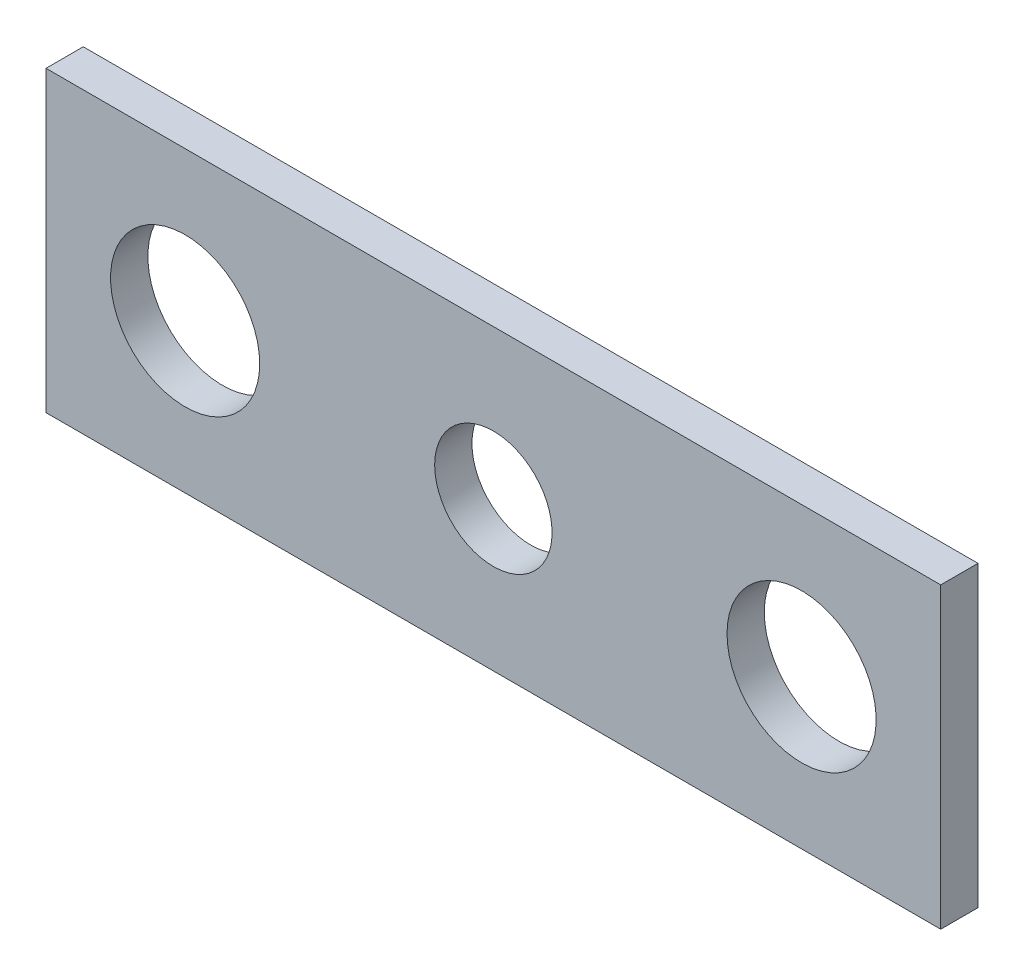
ISO-10303-21;
HEADER;
FILE_DESCRIPTION(('STEP AP214'),'2;1');
FILE_NAME('part.step','',(''),(''),'','','');
FILE_SCHEMA(('AUTOMOTIVE_DESIGN { 1 0 10303 214 1 1 1 1 }'));
ENDSEC;
DATA;
#1=APPLICATION_CONTEXT('core data for automotive mechanical design processes');
#2=APPLICATION_PROTOCOL_DEFINITION('international standard','automotive_design',2000,#1);
#3=PRODUCT_CONTEXT('',#1,'mechanical');
#4=PRODUCT('Part','Part','',(#3));
#5=PRODUCT_RELATED_PRODUCT_CATEGORY('part','',(#4));
#6=PRODUCT_DEFINITION_FORMATION('','',#4);
#7=PRODUCT_DEFINITION_CONTEXT('part definition',#1,'design');
#8=PRODUCT_DEFINITION('design','',#6,#7);
#9=PRODUCT_DEFINITION_SHAPE('','',#8);
#10=(LENGTH_UNIT() NAMED_UNIT(*) SI_UNIT(.MILLI.,.METRE.));
#11=(NAMED_UNIT(*) PLANE_ANGLE_UNIT() SI_UNIT($,.RADIAN.));
#12=(NAMED_UNIT(*) SI_UNIT($,.STERADIAN.) SOLID_ANGLE_UNIT());
#13=UNCERTAINTY_MEASURE_WITH_UNIT(LENGTH_MEASURE(1.E-05),#10,'distance_accuracy_value','');
#14=(GEOMETRIC_REPRESENTATION_CONTEXT(3) GLOBAL_UNCERTAINTY_ASSIGNED_CONTEXT((#13)) GLOBAL_UNIT_ASSIGNED_CONTEXT((#10,
#11,#12)) REPRESENTATION_CONTEXT('',''));
#15=CARTESIAN_POINT('',(0.,0.,0.));
#16=DIRECTION('',(0.,0.,1.));
#17=DIRECTION('',(1.,0.,0.));
#18=AXIS2_PLACEMENT_3D('',#15,#16,#17);
#19=CARTESIAN_POINT('',(0.,0.,6.35));
#20=DIRECTION('',(0.,0.,1.));
#21=DIRECTION('',(1.,0.,0.));
#22=AXIS2_PLACEMENT_3D('',#19,#20,#21);
#23=PLANE('',#22);
#24=CARTESIAN_POINT('',(-128.7,25.4,6.35));
#25=DIRECTION('',(0.,0.,1.));
#26=DIRECTION('',(1.,0.,0.));
#27=AXIS2_PLACEMENT_3D('',#24,#25,#26);
#28=CIRCLE('',#27,12.7);
#29=CARTESIAN_POINT('',(-116.,25.4,6.35));
#30=VERTEX_POINT('',#29);
#31=EDGE_CURVE('E115',#30,#30,#28,.T.);
#32=ORIENTED_EDGE('',*,*,#31,.F.);
#33=EDGE_LOOP('',(#32));
#34=FACE_BOUND('',#33,.T.);
#35=DIRECTION('',(0.,1.,0.));
#36=VECTOR('',#35,1.);
#37=CARTESIAN_POINT('',(0.,0.,6.35));
#38=LINE('',#37,#36);
#39=CARTESIAN_POINT('',(0.,0.,6.35));
#40=VERTEX_POINT('',#39);
#41=CARTESIAN_POINT('',(0.,50.8,6.35));
#42=VERTEX_POINT('',#41);
#43=EDGE_CURVE('E88',#40,#42,#38,.T.);
#44=ORIENTED_EDGE('',*,*,#43,.T.);
#45=DIRECTION('',(-1.,0.,0.));
#46=VECTOR('',#45,1.);
#47=CARTESIAN_POINT('',(0.,50.8,6.35));
#48=LINE('',#47,#46);
#49=CARTESIAN_POINT('',(-152.4,50.8,6.35));
#50=VERTEX_POINT('',#49);
#51=EDGE_CURVE('E83',#42,#50,#48,.T.);
#52=ORIENTED_EDGE('',*,*,#51,.T.);
#53=DIRECTION('',(0.,-1.,0.));
#54=VECTOR('',#53,1.);
#55=CARTESIAN_POINT('',(-152.4,0.,6.35));
#56=LINE('',#55,#54);
#57=CARTESIAN_POINT('',(-152.4,0.,6.35));
#58=VERTEX_POINT('',#57);
#59=EDGE_CURVE('E86',#50,#58,#56,.T.);
#60=ORIENTED_EDGE('',*,*,#59,.T.);
#61=DIRECTION('',(1.,0.,0.));
#62=VECTOR('',#61,1.);
#63=CARTESIAN_POINT('',(0.,0.,6.35));
#64=LINE('',#63,#62);
#65=EDGE_CURVE('E53',#58,#40,#64,.T.);
#66=ORIENTED_EDGE('',*,*,#65,.T.);
#67=EDGE_LOOP('',(#44,#52,#60,#66));
#68=FACE_BOUND('',#67,.T.);
#69=CARTESIAN_POINT('',(-76.2,25.4,6.35));
#70=DIRECTION('',(0.,0.,-1.));
#71=DIRECTION('',(-1.,0.,0.));
#72=AXIS2_PLACEMENT_3D('',#69,#70,#71);
#73=CIRCLE('',#72,9.99999999999999);
#74=CARTESIAN_POINT('',(-86.2,25.4,6.35));
#75=VERTEX_POINT('',#74);
#76=EDGE_CURVE('E121',#75,#75,#73,.T.);
#77=ORIENTED_EDGE('',*,*,#76,.T.);
#78=EDGE_LOOP('',(#77));
#79=FACE_BOUND('',#78,.T.);
#80=CARTESIAN_POINT('',(-23.7,25.4,6.35));
#81=DIRECTION('',(0.,0.,-1.));
#82=DIRECTION('',(-1.,0.,0.));
#83=AXIS2_PLACEMENT_3D('',#80,#81,#82);
#84=CIRCLE('',#83,12.7);
#85=CARTESIAN_POINT('',(-36.4,25.4,6.35));
#86=VERTEX_POINT('',#85);
#87=EDGE_CURVE('E103',#86,#86,#84,.T.);
#88=ORIENTED_EDGE('',*,*,#87,.T.);
#89=EDGE_LOOP('',(#88));
#90=FACE_BOUND('',#89,.T.);
#91=ADVANCED_FACE('F36',(#34,#68,#79,#90),#23,.T.);
#92=CARTESIAN_POINT('',(0.,0.,0.));
#93=DIRECTION('',(0.,0.,1.));
#94=DIRECTION('',(1.,0.,0.));
#95=AXIS2_PLACEMENT_3D('',#92,#93,#94);
#96=PLANE('',#95);
#97=CARTESIAN_POINT('',(-76.2,25.4,0.));
#98=DIRECTION('',(0.,0.,-1.));
#99=DIRECTION('',(-1.,0.,0.));
#100=AXIS2_PLACEMENT_3D('',#97,#98,#99);
#101=CIRCLE('',#100,9.99999999999999);
#102=CARTESIAN_POINT('',(-86.2,25.4,0.));
#103=VERTEX_POINT('',#102);
#104=EDGE_CURVE('E124',#103,#103,#101,.T.);
#105=ORIENTED_EDGE('',*,*,#104,.F.);
#106=EDGE_LOOP('',(#105));
#107=FACE_BOUND('',#106,.T.);
#108=CARTESIAN_POINT('',(-128.7,25.4,0.));
#109=DIRECTION('',(0.,0.,1.));
#110=DIRECTION('',(1.,0.,0.));
#111=AXIS2_PLACEMENT_3D('',#108,#109,#110);
#112=CIRCLE('',#111,12.7);
#113=CARTESIAN_POINT('',(-116.,25.4,0.));
#114=VERTEX_POINT('',#113);
#115=EDGE_CURVE('E118',#114,#114,#112,.T.);
#116=ORIENTED_EDGE('',*,*,#115,.T.);
#117=EDGE_LOOP('',(#116));
#118=FACE_BOUND('',#117,.T.);
#119=DIRECTION('',(0.,1.,0.));
#120=VECTOR('',#119,1.);
#121=CARTESIAN_POINT('',(0.,0.,0.));
#122=LINE('',#121,#120);
#123=CARTESIAN_POINT('',(0.,0.,0.));
#124=VERTEX_POINT('',#123);
#125=CARTESIAN_POINT('',(0.,50.8,0.));
#126=VERTEX_POINT('',#125);
#127=EDGE_CURVE('E100',#124,#126,#122,.T.);
#128=ORIENTED_EDGE('',*,*,#127,.F.);
#129=DIRECTION('',(1.,0.,0.));
#130=VECTOR('',#129,1.);
#131=CARTESIAN_POINT('',(0.,0.,0.));
#132=LINE('',#131,#130);
#133=CARTESIAN_POINT('',(-152.4,0.,0.));
#134=VERTEX_POINT('',#133);
#135=EDGE_CURVE('E76',#134,#124,#132,.T.);
#136=ORIENTED_EDGE('',*,*,#135,.F.);
#137=DIRECTION('',(0.,-1.,0.));
#138=VECTOR('',#137,1.);
#139=CARTESIAN_POINT('',(-152.4,0.,0.));
#140=LINE('',#139,#138);
#141=CARTESIAN_POINT('',(-152.4,50.8,0.));
#142=VERTEX_POINT('',#141);
#143=EDGE_CURVE('E70',#142,#134,#140,.T.);
#144=ORIENTED_EDGE('',*,*,#143,.F.);
#145=DIRECTION('',(-1.,0.,0.));
#146=VECTOR('',#145,1.);
#147=CARTESIAN_POINT('',(0.,50.8,0.));
#148=LINE('',#147,#146);
#149=EDGE_CURVE('E92',#126,#142,#148,.T.);
#150=ORIENTED_EDGE('',*,*,#149,.F.);
#151=EDGE_LOOP('',(#128,#136,#144,#150));
#152=FACE_BOUND('',#151,.T.);
#153=CARTESIAN_POINT('',(-23.7,25.4,0.));
#154=DIRECTION('',(0.,0.,-1.));
#155=DIRECTION('',(-1.,0.,0.));
#156=AXIS2_PLACEMENT_3D('',#153,#154,#155);
#157=CIRCLE('',#156,12.7);
#158=CARTESIAN_POINT('',(-36.4,25.4,0.));
#159=VERTEX_POINT('',#158);
#160=EDGE_CURVE('E127',#159,#159,#157,.T.);
#161=ORIENTED_EDGE('',*,*,#160,.F.);
#162=EDGE_LOOP('',(#161));
#163=FACE_BOUND('',#162,.T.);
#164=ADVANCED_FACE('F111',(#107,#118,#152,#163),#96,.F.);
#165=CARTESIAN_POINT('',(0.,0.,6.35));
#166=DIRECTION('',(-1.,0.,0.));
#167=DIRECTION('',(0.,0.,1.));
#168=AXIS2_PLACEMENT_3D('',#165,#166,#167);
#169=PLANE('',#168);
#170=ORIENTED_EDGE('',*,*,#127,.T.);
#171=DIRECTION('',(0.,0.,-1.));
#172=VECTOR('',#171,1.);
#173=CARTESIAN_POINT('',(0.,50.8,6.35));
#174=LINE('',#173,#172);
#175=EDGE_CURVE('E11',#42,#126,#174,.T.);
#176=ORIENTED_EDGE('',*,*,#175,.F.);
#177=ORIENTED_EDGE('',*,*,#43,.F.);
#178=DIRECTION('',(0.,0.,-1.));
#179=VECTOR('',#178,1.);
#180=CARTESIAN_POINT('',(0.,0.,6.35));
#181=LINE('',#180,#179);
#182=EDGE_CURVE('E96',#40,#124,#181,.T.);
#183=ORIENTED_EDGE('',*,*,#182,.T.);
#184=EDGE_LOOP('',(#170,#176,#177,#183));
#185=FACE_BOUND('',#184,.T.);
#186=ADVANCED_FACE('F38',(#185),#169,.F.);
#187=CARTESIAN_POINT('',(0.,50.8,6.35));
#188=DIRECTION('',(0.,-1.,0.));
#189=DIRECTION('',(1.,0.,0.));
#190=AXIS2_PLACEMENT_3D('',#187,#188,#189);
#191=PLANE('',#190);
#192=ORIENTED_EDGE('',*,*,#149,.T.);
#193=DIRECTION('',(0.,0.,-1.));
#194=VECTOR('',#193,1.);
#195=CARTESIAN_POINT('',(-152.4,50.8,6.35));
#196=LINE('',#195,#194);
#197=EDGE_CURVE('E45',#50,#142,#196,.T.);
#198=ORIENTED_EDGE('',*,*,#197,.F.);
#199=ORIENTED_EDGE('',*,*,#51,.F.);
#200=ORIENTED_EDGE('',*,*,#175,.T.);
#201=EDGE_LOOP('',(#192,#198,#199,#200));
#202=FACE_BOUND('',#201,.T.);
#203=ADVANCED_FACE('F91',(#202),#191,.F.);
#204=CARTESIAN_POINT('',(-152.4,0.,6.35));
#205=DIRECTION('',(1.,0.,0.));
#206=DIRECTION('',(0.,0.,-1.));
#207=AXIS2_PLACEMENT_3D('',#204,#205,#206);
#208=PLANE('',#207);
#209=ORIENTED_EDGE('',*,*,#143,.T.);
#210=DIRECTION('',(0.,0.,-1.));
#211=VECTOR('',#210,1.);
#212=CARTESIAN_POINT('',(-152.4,0.,6.35));
#213=LINE('',#212,#211);
#214=EDGE_CURVE('E93',#58,#134,#213,.T.);
#215=ORIENTED_EDGE('',*,*,#214,.F.);
#216=ORIENTED_EDGE('',*,*,#59,.F.);
#217=ORIENTED_EDGE('',*,*,#197,.T.);
#218=EDGE_LOOP('',(#209,#215,#216,#217));
#219=FACE_BOUND('',#218,.T.);
#220=ADVANCED_FACE('F94',(#219),#208,.F.);
#221=CARTESIAN_POINT('',(0.,0.,6.35));
#222=DIRECTION('',(0.,1.,0.));
#223=DIRECTION('',(-1.,0.,0.));
#224=AXIS2_PLACEMENT_3D('',#221,#222,#223);
#225=PLANE('',#224);
#226=ORIENTED_EDGE('',*,*,#135,.T.);
#227=ORIENTED_EDGE('',*,*,#182,.F.);
#228=ORIENTED_EDGE('',*,*,#65,.F.);
#229=ORIENTED_EDGE('',*,*,#214,.T.);
#230=EDGE_LOOP('',(#226,#227,#228,#229));
#231=FACE_BOUND('',#230,.T.);
#232=ADVANCED_FACE('F108',(#231),#225,.F.);
#233=CARTESIAN_POINT('',(-128.7,25.4,6.35));
#234=DIRECTION('',(0.,0.,-1.));
#235=DIRECTION('',(-1.,0.,0.));
#236=AXIS2_PLACEMENT_3D('',#233,#234,#235);
#237=CYLINDRICAL_SURFACE('',#236,12.7);
#238=ORIENTED_EDGE('',*,*,#31,.T.);
#239=EDGE_LOOP('',(#238));
#240=FACE_BOUND('',#239,.T.);
#241=ORIENTED_EDGE('',*,*,#115,.F.);
#242=EDGE_LOOP('',(#241));
#243=FACE_BOUND('',#242,.T.);
#244=ADVANCED_FACE('F155',(#240,#243),#237,.F.);
#245=CARTESIAN_POINT('',(-76.2,25.4,6.35));
#246=DIRECTION('',(0.,0.,-1.));
#247=DIRECTION('',(-1.,0.,0.));
#248=AXIS2_PLACEMENT_3D('',#245,#246,#247);
#249=CYLINDRICAL_SURFACE('',#248,9.99999999999999);
#250=ORIENTED_EDGE('',*,*,#76,.F.);
#251=EDGE_LOOP('',(#250));
#252=FACE_BOUND('',#251,.T.);
#253=ORIENTED_EDGE('',*,*,#104,.T.);
#254=EDGE_LOOP('',(#253));
#255=FACE_BOUND('',#254,.T.);
#256=ADVANCED_FACE('F137',(#252,#255),#249,.F.);
#257=CARTESIAN_POINT('',(-23.7,25.4,6.35));
#258=DIRECTION('',(0.,0.,-1.));
#259=DIRECTION('',(-1.,0.,0.));
#260=AXIS2_PLACEMENT_3D('',#257,#258,#259);
#261=CYLINDRICAL_SURFACE('',#260,12.7);
#262=ORIENTED_EDGE('',*,*,#87,.F.);
#263=EDGE_LOOP('',(#262));
#264=FACE_BOUND('',#263,.T.);
#265=ORIENTED_EDGE('',*,*,#160,.T.);
#266=EDGE_LOOP('',(#265));
#267=FACE_BOUND('',#266,.T.);
#268=ADVANCED_FACE('F134',(#264,#267),#261,.F.);
#269=CLOSED_SHELL('',(#91,#164,#186,#203,#220,#232,#244,#256,#268));
#270=MANIFOLD_SOLID_BREP('B2',#269);
#271=ADVANCED_BREP_SHAPE_REPRESENTATION('',(#18,#270),#14);
#272=SHAPE_DEFINITION_REPRESENTATION(#9,#271);
ENDSEC;
END-ISO-10303-21;
